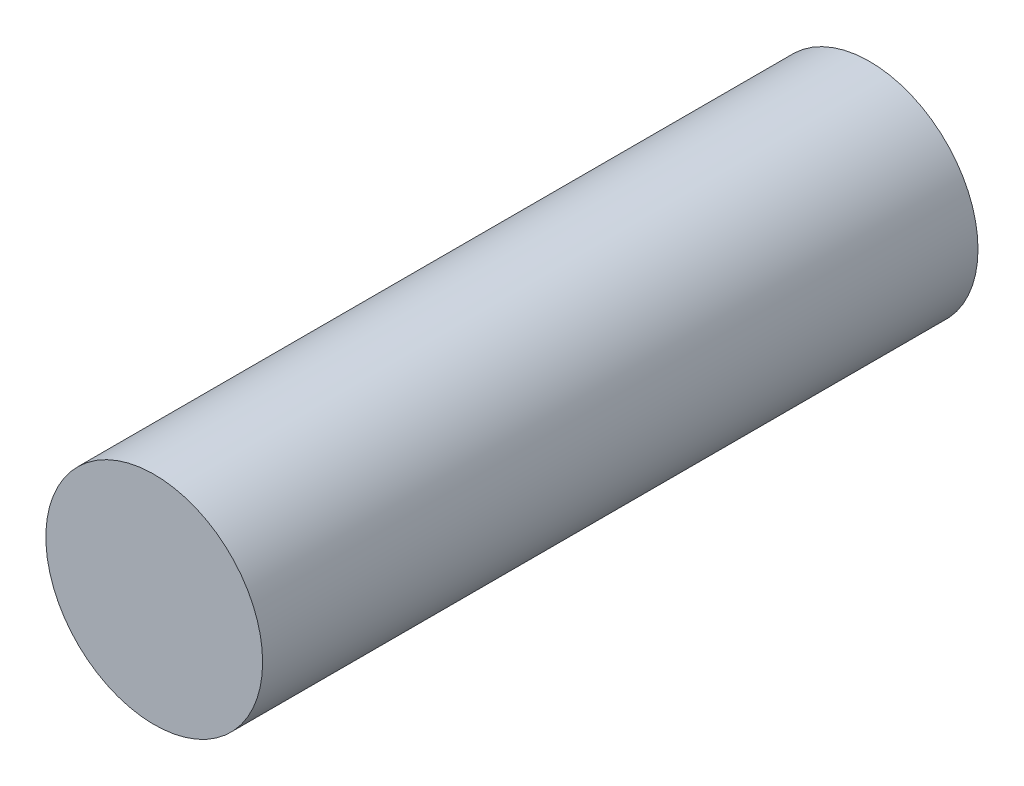
ISO-10303-21;
HEADER;
FILE_DESCRIPTION(('STEP AP214'),'2;1');
FILE_NAME('part.step','',(''),(''),'','','');
FILE_SCHEMA(('AUTOMOTIVE_DESIGN { 1 0 10303 214 1 1 1 1 }'));
ENDSEC;
DATA;
#1=APPLICATION_CONTEXT('core data for automotive mechanical design processes');
#2=APPLICATION_PROTOCOL_DEFINITION('international standard','automotive_design',2000,#1);
#3=PRODUCT_CONTEXT('',#1,'mechanical');
#4=PRODUCT('Part','Part','',(#3));
#5=PRODUCT_RELATED_PRODUCT_CATEGORY('part','',(#4));
#6=PRODUCT_DEFINITION_FORMATION('','',#4);
#7=PRODUCT_DEFINITION_CONTEXT('part definition',#1,'design');
#8=PRODUCT_DEFINITION('design','',#6,#7);
#9=PRODUCT_DEFINITION_SHAPE('','',#8);
#10=(LENGTH_UNIT() NAMED_UNIT(*) SI_UNIT(.MILLI.,.METRE.));
#11=(NAMED_UNIT(*) PLANE_ANGLE_UNIT() SI_UNIT($,.RADIAN.));
#12=(NAMED_UNIT(*) SI_UNIT($,.STERADIAN.) SOLID_ANGLE_UNIT());
#13=UNCERTAINTY_MEASURE_WITH_UNIT(LENGTH_MEASURE(1.E-05),#10,'distance_accuracy_value','');
#14=(GEOMETRIC_REPRESENTATION_CONTEXT(3) GLOBAL_UNCERTAINTY_ASSIGNED_CONTEXT((#13)) GLOBAL_UNIT_ASSIGNED_CONTEXT((#10,
#11,#12)) REPRESENTATION_CONTEXT('',''));
#15=CARTESIAN_POINT('',(0.,0.,0.));
#16=DIRECTION('',(0.,0.,1.));
#17=DIRECTION('',(1.,0.,0.));
#18=AXIS2_PLACEMENT_3D('',#15,#16,#17);
#19=CARTESIAN_POINT('',(0.,0.,66.));
#20=DIRECTION('',(0.,0.,-1.));
#21=DIRECTION('',(-1.,0.,0.));
#22=AXIS2_PLACEMENT_3D('',#19,#20,#21);
#23=CYLINDRICAL_SURFACE('',#22,10.);
#24=CARTESIAN_POINT('',(0.,0.,66.));
#25=DIRECTION('',(0.,0.,1.));
#26=DIRECTION('',(1.,0.,0.));
#27=AXIS2_PLACEMENT_3D('',#24,#25,#26);
#28=CIRCLE('',#27,10.);
#29=CARTESIAN_POINT('',(10.,0.,66.));
#30=VERTEX_POINT('',#29);
#31=EDGE_CURVE('E10',#30,#30,#28,.T.);
#32=ORIENTED_EDGE('',*,*,#31,.F.);
#33=EDGE_LOOP('',(#32));
#34=FACE_BOUND('',#33,.T.);
#35=CARTESIAN_POINT('',(0.,0.,0.));
#36=DIRECTION('',(0.,0.,1.));
#37=DIRECTION('',(1.,0.,0.));
#38=AXIS2_PLACEMENT_3D('',#35,#36,#37);
#39=CIRCLE('',#38,10.);
#40=CARTESIAN_POINT('',(10.,0.,0.));
#41=VERTEX_POINT('',#40);
#42=EDGE_CURVE('E38',#41,#41,#39,.T.);
#43=ORIENTED_EDGE('',*,*,#42,.T.);
#44=EDGE_LOOP('',(#43));
#45=FACE_BOUND('',#44,.T.);
#46=ADVANCED_FACE('F35',(#34,#45),#23,.T.);
#47=CARTESIAN_POINT('',(0.,0.,66.));
#48=DIRECTION('',(0.,0.,1.));
#49=DIRECTION('',(1.,0.,0.));
#50=AXIS2_PLACEMENT_3D('',#47,#48,#49);
#51=PLANE('',#50);
#52=ORIENTED_EDGE('',*,*,#31,.T.);
#53=EDGE_LOOP('',(#52));
#54=FACE_BOUND('',#53,.T.);
#55=ADVANCED_FACE('F50',(#54),#51,.T.);
#56=CARTESIAN_POINT('',(0.,0.,0.));
#57=DIRECTION('',(0.,0.,1.));
#58=DIRECTION('',(1.,0.,0.));
#59=AXIS2_PLACEMENT_3D('',#56,#57,#58);
#60=PLANE('',#59);
#61=ORIENTED_EDGE('',*,*,#42,.F.);
#62=EDGE_LOOP('',(#61));
#63=FACE_BOUND('',#62,.T.);
#64=ADVANCED_FACE('F48',(#63),#60,.F.);
#65=CLOSED_SHELL('',(#46,#55,#64));
#66=MANIFOLD_SOLID_BREP('B2',#65);
#67=ADVANCED_BREP_SHAPE_REPRESENTATION('',(#18,#66),#14);
#68=SHAPE_DEFINITION_REPRESENTATION(#9,#67);
ENDSEC;
END-ISO-10303-21;
